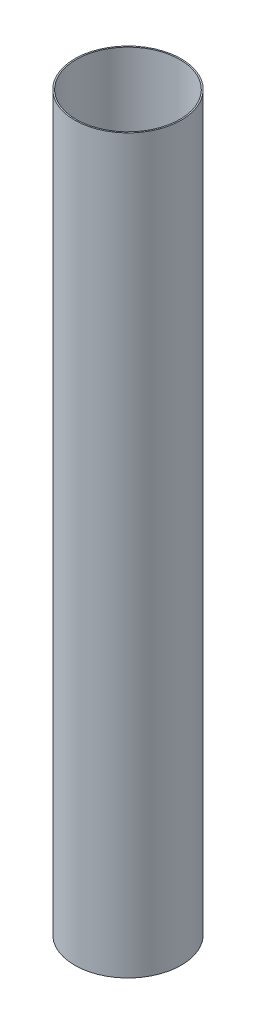
ISO-10303-21;
HEADER;
FILE_DESCRIPTION(('STEP AP214'),'2;1');
FILE_NAME('part.step','',(''),(''),'','','');
FILE_SCHEMA(('AUTOMOTIVE_DESIGN { 1 0 10303 214 1 1 1 1 }'));
ENDSEC;
DATA;
#1=APPLICATION_CONTEXT('core data for automotive mechanical design processes');
#2=APPLICATION_PROTOCOL_DEFINITION('international standard','automotive_design',2000,#1);
#3=PRODUCT_CONTEXT('',#1,'mechanical');
#4=PRODUCT('Part','Part','',(#3));
#5=PRODUCT_RELATED_PRODUCT_CATEGORY('part','',(#4));
#6=PRODUCT_DEFINITION_FORMATION('','',#4);
#7=PRODUCT_DEFINITION_CONTEXT('part definition',#1,'design');
#8=PRODUCT_DEFINITION('design','',#6,#7);
#9=PRODUCT_DEFINITION_SHAPE('','',#8);
#10=(LENGTH_UNIT() NAMED_UNIT(*) SI_UNIT(.MILLI.,.METRE.));
#11=(NAMED_UNIT(*) PLANE_ANGLE_UNIT() SI_UNIT($,.RADIAN.));
#12=(NAMED_UNIT(*) SI_UNIT($,.STERADIAN.) SOLID_ANGLE_UNIT());
#13=UNCERTAINTY_MEASURE_WITH_UNIT(LENGTH_MEASURE(1.E-05),#10,'distance_accuracy_value','');
#14=(GEOMETRIC_REPRESENTATION_CONTEXT(3) GLOBAL_UNCERTAINTY_ASSIGNED_CONTEXT((#13)) GLOBAL_UNIT_ASSIGNED_CONTEXT((#10,
#11,#12)) REPRESENTATION_CONTEXT('',''));
#15=CARTESIAN_POINT('',(0.,0.,0.));
#16=DIRECTION('',(0.,0.,1.));
#17=DIRECTION('',(1.,0.,0.));
#18=AXIS2_PLACEMENT_3D('',#15,#16,#17);
#19=CARTESIAN_POINT('',(0.,550.,0.));
#20=DIRECTION('',(0.,1.,0.));
#21=DIRECTION('',(0.,0.,1.));
#22=AXIS2_PLACEMENT_3D('',#19,#20,#21);
#23=PLANE('',#22);
#24=CARTESIAN_POINT('',(0.,550.,0.));
#25=DIRECTION('',(0.,1.,0.));
#26=DIRECTION('',(0.,0.,1.));
#27=AXIS2_PLACEMENT_3D('',#24,#25,#26);
#28=CIRCLE('',#27,40.);
#29=CARTESIAN_POINT('',(0.,550.,40.));
#30=VERTEX_POINT('',#29);
#31=EDGE_CURVE('E10',#30,#30,#28,.T.);
#32=ORIENTED_EDGE('',*,*,#31,.T.);
#33=EDGE_LOOP('',(#32));
#34=FACE_BOUND('',#33,.T.);
#35=CARTESIAN_POINT('',(0.,550.,0.));
#36=DIRECTION('',(0.,1.,0.));
#37=DIRECTION('',(0.,0.,1.));
#38=AXIS2_PLACEMENT_3D('',#35,#36,#37);
#39=CIRCLE('',#38,39.);
#40=CARTESIAN_POINT('',(0.,550.,39.));
#41=VERTEX_POINT('',#40);
#42=EDGE_CURVE('E48',#41,#41,#39,.T.);
#43=ORIENTED_EDGE('',*,*,#42,.F.);
#44=EDGE_LOOP('',(#43));
#45=FACE_BOUND('',#44,.T.);
#46=ADVANCED_FACE('F37',(#34,#45),#23,.T.);
#47=CARTESIAN_POINT('',(0.,0.,0.));
#48=DIRECTION('',(0.,1.,0.));
#49=DIRECTION('',(0.,0.,1.));
#50=AXIS2_PLACEMENT_3D('',#47,#48,#49);
#51=PLANE('',#50);
#52=CARTESIAN_POINT('',(0.,0.,0.));
#53=DIRECTION('',(0.,1.,0.));
#54=DIRECTION('',(0.,0.,1.));
#55=AXIS2_PLACEMENT_3D('',#52,#53,#54);
#56=CIRCLE('',#55,40.);
#57=CARTESIAN_POINT('',(0.,0.,40.));
#58=VERTEX_POINT('',#57);
#59=EDGE_CURVE('E41',#58,#58,#56,.T.);
#60=ORIENTED_EDGE('',*,*,#59,.F.);
#61=EDGE_LOOP('',(#60));
#62=FACE_BOUND('',#61,.T.);
#63=CARTESIAN_POINT('',(0.,0.,0.));
#64=DIRECTION('',(0.,1.,0.));
#65=DIRECTION('',(0.,0.,1.));
#66=AXIS2_PLACEMENT_3D('',#63,#64,#65);
#67=CIRCLE('',#66,39.);
#68=CARTESIAN_POINT('',(0.,0.,39.));
#69=VERTEX_POINT('',#68);
#70=EDGE_CURVE('E50',#69,#69,#67,.T.);
#71=ORIENTED_EDGE('',*,*,#70,.T.);
#72=EDGE_LOOP('',(#71));
#73=FACE_BOUND('',#72,.T.);
#74=ADVANCED_FACE('F60',(#62,#73),#51,.F.);
#75=CARTESIAN_POINT('',(0.,550.,0.));
#76=DIRECTION('',(0.,-1.,0.));
#77=DIRECTION('',(0.,0.,-1.));
#78=AXIS2_PLACEMENT_3D('',#75,#76,#77);
#79=CYLINDRICAL_SURFACE('',#78,40.);
#80=ORIENTED_EDGE('',*,*,#31,.F.);
#81=EDGE_LOOP('',(#80));
#82=FACE_BOUND('',#81,.T.);
#83=ORIENTED_EDGE('',*,*,#59,.T.);
#84=EDGE_LOOP('',(#83));
#85=FACE_BOUND('',#84,.T.);
#86=ADVANCED_FACE('F39',(#82,#85),#79,.T.);
#87=CARTESIAN_POINT('',(0.,550.,0.));
#88=DIRECTION('',(0.,-1.,0.));
#89=DIRECTION('',(0.,0.,-1.));
#90=AXIS2_PLACEMENT_3D('',#87,#88,#89);
#91=CYLINDRICAL_SURFACE('',#90,39.);
#92=ORIENTED_EDGE('',*,*,#42,.T.);
#93=EDGE_LOOP('',(#92));
#94=FACE_BOUND('',#93,.T.);
#95=ORIENTED_EDGE('',*,*,#70,.F.);
#96=EDGE_LOOP('',(#95));
#97=FACE_BOUND('',#96,.T.);
#98=ADVANCED_FACE('F56',(#94,#97),#91,.F.);
#99=CLOSED_SHELL('',(#46,#74,#86,#98));
#100=MANIFOLD_SOLID_BREP('B2',#99);
#101=ADVANCED_BREP_SHAPE_REPRESENTATION('',(#18,#100),#14);
#102=SHAPE_DEFINITION_REPRESENTATION(#9,#101);
ENDSEC;
END-ISO-10303-21;
